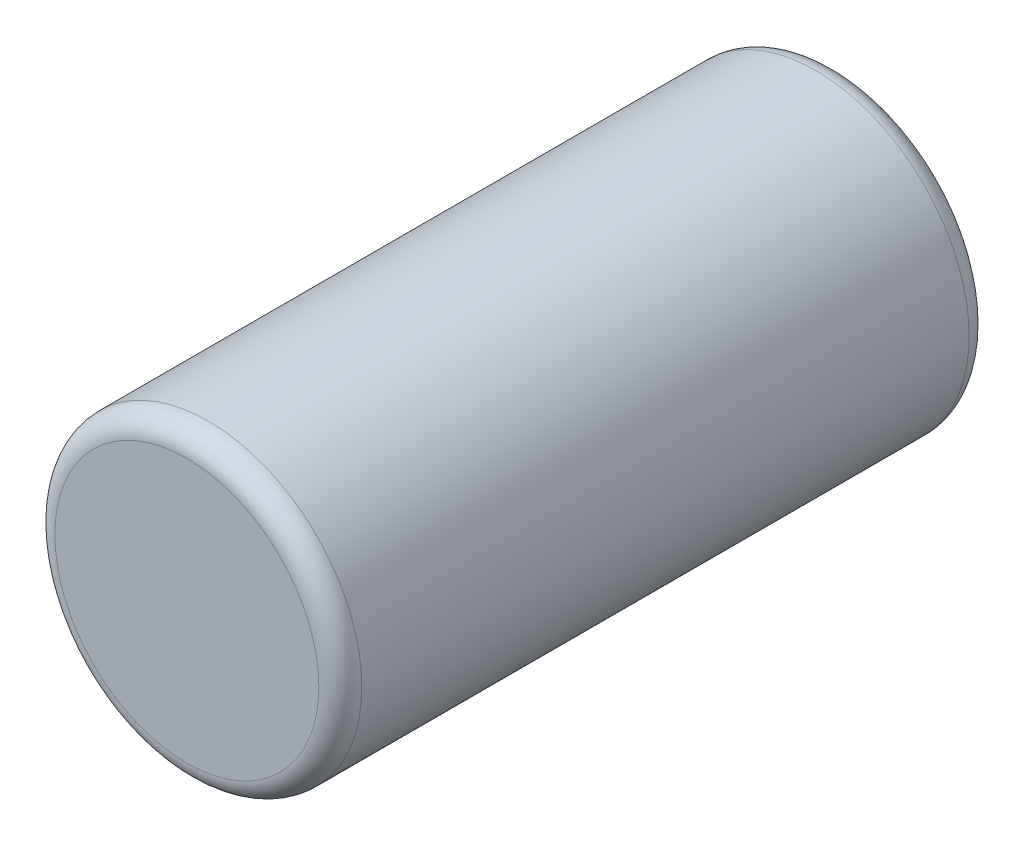
ISO-10303-21;
HEADER;
FILE_DESCRIPTION(('STEP AP214'),'2;1');
FILE_NAME('part.step','',(''),(''),'','','');
FILE_SCHEMA(('AUTOMOTIVE_DESIGN { 1 0 10303 214 1 1 1 1 }'));
ENDSEC;
DATA;
#1=APPLICATION_CONTEXT('core data for automotive mechanical design processes');
#2=APPLICATION_PROTOCOL_DEFINITION('international standard','automotive_design',2000,#1);
#3=PRODUCT_CONTEXT('',#1,'mechanical');
#4=PRODUCT('Part','Part','',(#3));
#5=PRODUCT_RELATED_PRODUCT_CATEGORY('part','',(#4));
#6=PRODUCT_DEFINITION_FORMATION('','',#4);
#7=PRODUCT_DEFINITION_CONTEXT('part definition',#1,'design');
#8=PRODUCT_DEFINITION('design','',#6,#7);
#9=PRODUCT_DEFINITION_SHAPE('','',#8);
#10=(LENGTH_UNIT() NAMED_UNIT(*) SI_UNIT(.MILLI.,.METRE.));
#11=(NAMED_UNIT(*) PLANE_ANGLE_UNIT() SI_UNIT($,.RADIAN.));
#12=(NAMED_UNIT(*) SI_UNIT($,.STERADIAN.) SOLID_ANGLE_UNIT());
#13=UNCERTAINTY_MEASURE_WITH_UNIT(LENGTH_MEASURE(1.E-05),#10,'distance_accuracy_value','');
#14=(GEOMETRIC_REPRESENTATION_CONTEXT(3) GLOBAL_UNCERTAINTY_ASSIGNED_CONTEXT((#13)) GLOBAL_UNIT_ASSIGNED_CONTEXT((#10,
#11,#12)) REPRESENTATION_CONTEXT('',''));
#15=CARTESIAN_POINT('',(0.,0.,0.));
#16=DIRECTION('',(0.,0.,1.));
#17=DIRECTION('',(1.,0.,0.));
#18=AXIS2_PLACEMENT_3D('',#15,#16,#17);
#19=CARTESIAN_POINT('',(0.,0.,0.));
#20=DIRECTION('',(0.,0.,-0.999999999999999));
#21=DIRECTION('',(-1.,0.,0.));
#22=AXIS2_PLACEMENT_3D('',#19,#20,#21);
#23=PLANE('',#22);
#24=CARTESIAN_POINT('',(0.,0.,0.));
#25=DIRECTION('',(0.,0.,0.999999999999999));
#26=DIRECTION('',(1.,0.,0.));
#27=AXIS2_PLACEMENT_3D('',#24,#25,#26);
#28=CIRCLE('',#27,6.15);
#29=CARTESIAN_POINT('',(6.15,0.,0.));
#30=VERTEX_POINT('',#29);
#31=EDGE_CURVE('E10',#30,#30,#28,.T.);
#32=ORIENTED_EDGE('',*,*,#31,.T.);
#33=EDGE_LOOP('',(#32));
#34=FACE_BOUND('',#33,.T.);
#35=ADVANCED_FACE('F41',(#34),#23,.F.);
#36=CARTESIAN_POINT('',(0.,0.,-1.));
#37=DIRECTION('',(0.,0.,0.999999999999999));
#38=DIRECTION('',(1.,0.,0.));
#39=AXIS2_PLACEMENT_3D('',#36,#37,#38);
#40=TOROIDAL_SURFACE('',#39,6.15,1.);
#41=ORIENTED_EDGE('',*,*,#31,.F.);
#42=EDGE_LOOP('',(#41));
#43=FACE_BOUND('',#42,.T.);
#44=CARTESIAN_POINT('',(0.,0.,-1.));
#45=DIRECTION('',(0.,0.,0.999999999999999));
#46=DIRECTION('',(1.,0.,0.));
#47=AXIS2_PLACEMENT_3D('',#44,#45,#46);
#48=CIRCLE('',#47,7.15);
#49=CARTESIAN_POINT('',(7.15,0.,-1.));
#50=VERTEX_POINT('',#49);
#51=EDGE_CURVE('E48',#50,#50,#48,.T.);
#52=ORIENTED_EDGE('',*,*,#51,.T.);
#53=EDGE_LOOP('',(#52));
#54=FACE_BOUND('',#53,.T.);
#55=ADVANCED_FACE('F80',(#43,#54),#40,.T.);
#56=CARTESIAN_POINT('',(0.,0.,0.));
#57=DIRECTION('',(0.,0.,0.999999999999999));
#58=DIRECTION('',(1.,0.,0.));
#59=AXIS2_PLACEMENT_3D('',#56,#57,#58);
#60=CYLINDRICAL_SURFACE('',#59,7.15);
#61=CARTESIAN_POINT('',(0.,0.,-29.3));
#62=DIRECTION('',(0.,0.,0.999999999999999));
#63=DIRECTION('',(1.,0.,0.));
#64=AXIS2_PLACEMENT_3D('',#61,#62,#63);
#65=CIRCLE('',#64,7.15);
#66=CARTESIAN_POINT('',(7.15,0.,-29.3));
#67=VERTEX_POINT('',#66);
#68=EDGE_CURVE('E54',#67,#67,#65,.T.);
#69=CARTESIAN_POINT('',(7.15,0.,-1.));
#70=CARTESIAN_POINT('',(7.15,0.,-1.29479166666667));
#71=CARTESIAN_POINT('',(7.15,0.,-1.58958333333333));
#72=CARTESIAN_POINT('',(7.15,0.,-2.17916666666667));
#73=CARTESIAN_POINT('',(7.15,0.,-2.47395833333333));
#74=CARTESIAN_POINT('',(7.15,0.,-3.06354166666667));
#75=CARTESIAN_POINT('',(7.15,0.,-3.35833333333333));
#76=CARTESIAN_POINT('',(7.15,0.,-3.94791666666667));
#77=CARTESIAN_POINT('',(7.15,0.,-4.24270833333333));
#78=CARTESIAN_POINT('',(7.15,0.,-4.83229166666667));
#79=CARTESIAN_POINT('',(7.15,0.,-5.12708333333333));
#80=CARTESIAN_POINT('',(7.15,0.,-5.71666666666667));
#81=CARTESIAN_POINT('',(7.15,0.,-6.01145833333333));
#82=CARTESIAN_POINT('',(7.15,0.,-6.60104166666667));
#83=CARTESIAN_POINT('',(7.15,0.,-6.89583333333333));
#84=CARTESIAN_POINT('',(7.15,0.,-7.48541666666667));
#85=CARTESIAN_POINT('',(7.15,0.,-7.78020833333333));
#86=CARTESIAN_POINT('',(7.15,0.,-8.36979166666667));
#87=CARTESIAN_POINT('',(7.15,0.,-8.66458333333333));
#88=CARTESIAN_POINT('',(7.15,0.,-9.25416666666667));
#89=CARTESIAN_POINT('',(7.15,0.,-9.54895833333333));
#90=CARTESIAN_POINT('',(7.15,0.,-10.1385416666667));
#91=CARTESIAN_POINT('',(7.15,0.,-10.4333333333333));
#92=CARTESIAN_POINT('',(7.15,0.,-11.0229166666667));
#93=CARTESIAN_POINT('',(7.15,0.,-11.3177083333333));
#94=CARTESIAN_POINT('',(7.15,0.,-11.9072916666667));
#95=CARTESIAN_POINT('',(7.15,0.,-12.2020833333333));
#96=CARTESIAN_POINT('',(7.15,0.,-12.7916666666667));
#97=CARTESIAN_POINT('',(7.15,0.,-13.0864583333333));
#98=CARTESIAN_POINT('',(7.15,0.,-13.6760416666667));
#99=CARTESIAN_POINT('',(7.15,0.,-13.9708333333333));
#100=CARTESIAN_POINT('',(7.15,0.,-14.5604166666667));
#101=CARTESIAN_POINT('',(7.15,0.,-14.8552083333333));
#102=CARTESIAN_POINT('',(7.15,0.,-15.4447916666667));
#103=CARTESIAN_POINT('',(7.15,0.,-15.7395833333333));
#104=CARTESIAN_POINT('',(7.15,0.,-16.3291666666667));
#105=CARTESIAN_POINT('',(7.15,0.,-16.6239583333333));
#106=CARTESIAN_POINT('',(7.15,0.,-17.2135416666667));
#107=CARTESIAN_POINT('',(7.15,0.,-17.5083333333333));
#108=CARTESIAN_POINT('',(7.15,0.,-18.0979166666667));
#109=CARTESIAN_POINT('',(7.15,0.,-18.3927083333333));
#110=CARTESIAN_POINT('',(7.15,0.,-18.9822916666667));
#111=CARTESIAN_POINT('',(7.15,0.,-19.2770833333333));
#112=CARTESIAN_POINT('',(7.15,0.,-19.8666666666667));
#113=CARTESIAN_POINT('',(7.15,0.,-20.1614583333333));
#114=CARTESIAN_POINT('',(7.15,0.,-20.7510416666667));
#115=CARTESIAN_POINT('',(7.15,0.,-21.0458333333333));
#116=CARTESIAN_POINT('',(7.15,0.,-21.6354166666667));
#117=CARTESIAN_POINT('',(7.15,0.,-21.9302083333333));
#118=CARTESIAN_POINT('',(7.15,0.,-22.5197916666667));
#119=CARTESIAN_POINT('',(7.15,0.,-22.8145833333333));
#120=CARTESIAN_POINT('',(7.15,0.,-23.4041666666667));
#121=CARTESIAN_POINT('',(7.15,0.,-23.6989583333333));
#122=CARTESIAN_POINT('',(7.15,0.,-24.2885416666667));
#123=CARTESIAN_POINT('',(7.15,0.,-24.5833333333333));
#124=CARTESIAN_POINT('',(7.15,0.,-25.1729166666667));
#125=CARTESIAN_POINT('',(7.15,0.,-25.4677083333333));
#126=CARTESIAN_POINT('',(7.15,0.,-26.0572916666667));
#127=CARTESIAN_POINT('',(7.15,0.,-26.3520833333333));
#128=CARTESIAN_POINT('',(7.15,0.,-26.9416666666667));
#129=CARTESIAN_POINT('',(7.15,0.,-27.2364583333333));
#130=CARTESIAN_POINT('',(7.15,0.,-27.8260416666667));
#131=CARTESIAN_POINT('',(7.15,0.,-28.1208333333333));
#132=CARTESIAN_POINT('',(7.15,0.,-28.7104166666667));
#133=CARTESIAN_POINT('',(7.15,0.,-29.0052083333333));
#134=CARTESIAN_POINT('',(7.15,0.,-29.3));
#135=B_SPLINE_CURVE_WITH_KNOTS('',3,(#69,#70,#71,#72,#73,#74,#75,#76,#77,#78,#79,#80,#81,#82,
#83,#84,#85,#86,#87,#88,#89,#90,#91,#92,#93,#94,#95,#96,#97,#98,#99,#100,#101,#102,#103,#104,
#105,#106,#107,#108,#109,#110,#111,#112,#113,#114,#115,#116,#117,#118,#119,#120,#121,#122,#123,
#124,#125,#126,#127,#128,#129,#130,#131,#132,#133,#134),.UNSPECIFIED.,.F.,.F.,(4,2,2,2,2,2,2,2,
2,2,2,2,2,2,2,2,2,2,2,2,2,2,2,2,2,2,2,2,2,2,2,2,4),(0.,0.884375,1.76875,2.653125,3.5375,
4.421875,5.30625,6.190625,7.075,7.959375,8.84375,9.728125,10.6125,11.496875,12.38125,13.265625,
14.15,15.034375,15.91875,16.803125,17.6875,18.571875,19.45625,20.340625,21.225,22.109375,
22.99375,23.878125,24.7625,25.646875,26.53125,27.415625,28.3),.UNSPECIFIED.);
#136=EDGE_CURVE('BSEAM76',#50,#67,#135,.T.);
#137=ORIENTED_EDGE('',*,*,#51,.F.);
#138=ORIENTED_EDGE('',*,*,#68,.T.);
#139=ORIENTED_EDGE('',*,*,#136,.T.);
#140=ORIENTED_EDGE('',*,*,#136,.F.);
#141=EDGE_LOOP('',(#137,#139,#138,#140));
#142=FACE_BOUND('',#141,.T.);
#143=ADVANCED_FACE('F76',(#142),#60,.T.);
#144=CARTESIAN_POINT('',(0.,0.,-29.3));
#145=DIRECTION('',(0.,0.,0.999999999999999));
#146=DIRECTION('',(1.,0.,0.));
#147=AXIS2_PLACEMENT_3D('',#144,#145,#146);
#148=TOROIDAL_SURFACE('',#147,6.15,1.);
#149=ORIENTED_EDGE('',*,*,#68,.F.);
#150=EDGE_LOOP('',(#149));
#151=FACE_BOUND('',#150,.T.);
#152=CARTESIAN_POINT('',(0.,0.,-30.3));
#153=DIRECTION('',(0.,0.,0.999999999999999));
#154=DIRECTION('',(1.,0.,0.));
#155=AXIS2_PLACEMENT_3D('',#152,#153,#154);
#156=CIRCLE('',#155,6.15);
#157=CARTESIAN_POINT('',(6.15000000000003,0.,-30.3));
#158=VERTEX_POINT('',#157);
#159=EDGE_CURVE('E60',#158,#158,#156,.T.);
#160=ORIENTED_EDGE('',*,*,#159,.T.);
#161=EDGE_LOOP('',(#160));
#162=FACE_BOUND('',#161,.T.);
#163=ADVANCED_FACE('F68',(#151,#162),#148,.T.);
#164=CARTESIAN_POINT('',(0.,6.15000000000002,-30.3));
#165=DIRECTION('',(0.,0.,0.999999999999999));
#166=DIRECTION('',(1.,0.,0.));
#167=AXIS2_PLACEMENT_3D('',#164,#165,#166);
#168=PLANE('',#167);
#169=ORIENTED_EDGE('',*,*,#159,.F.);
#170=EDGE_LOOP('',(#169));
#171=FACE_BOUND('',#170,.T.);
#172=ADVANCED_FACE('F70',(#171),#168,.F.);
#173=CLOSED_SHELL('',(#35,#55,#143,#163,#172));
#174=MANIFOLD_SOLID_BREP('B2',#173);
#175=ADVANCED_BREP_SHAPE_REPRESENTATION('',(#18,#174),#14);
#176=SHAPE_DEFINITION_REPRESENTATION(#9,#175);
ENDSEC;
END-ISO-10303-21;
